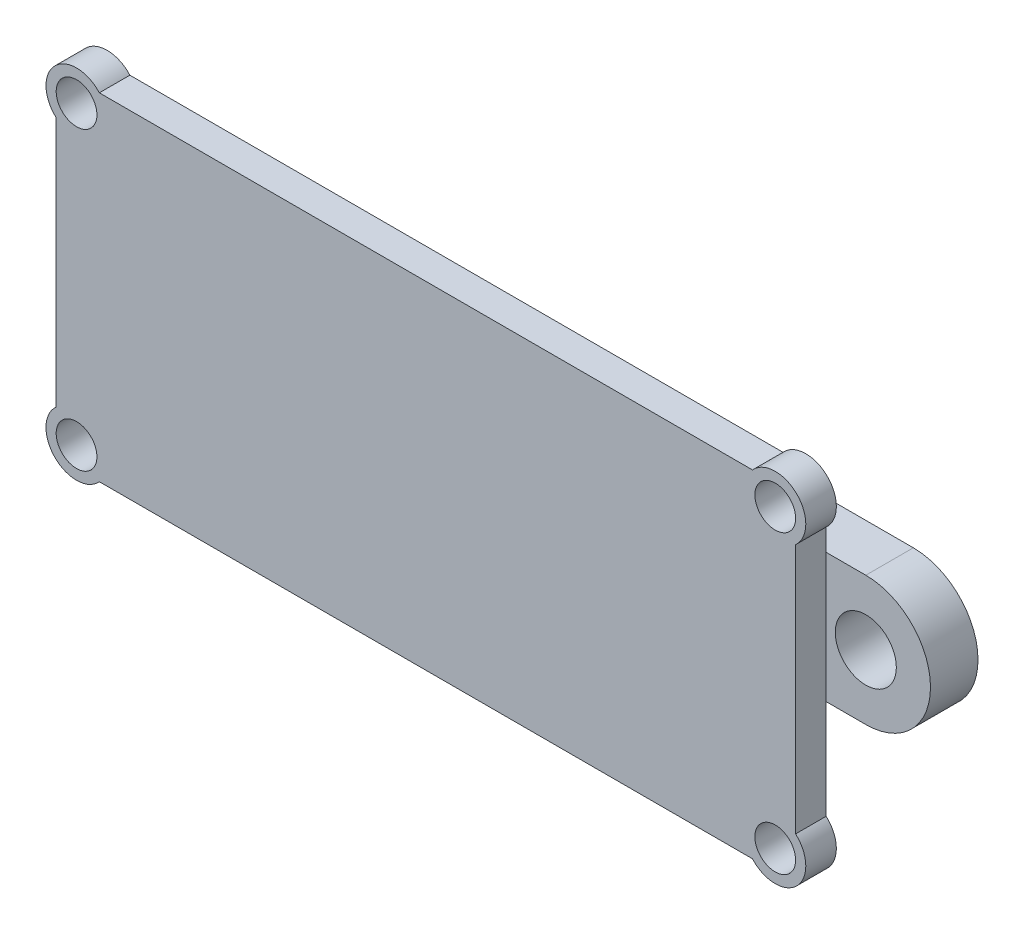
ISO-10303-21;
HEADER;
FILE_DESCRIPTION(('STEP AP214'),'2;1');
FILE_NAME('part.step','',(''),(''),'','','');
FILE_SCHEMA(('AUTOMOTIVE_DESIGN { 1 0 10303 214 1 1 1 1 }'));
ENDSEC;
DATA;
#1=APPLICATION_CONTEXT('core data for automotive mechanical design processes');
#2=APPLICATION_PROTOCOL_DEFINITION('international standard','automotive_design',2000,#1);
#3=PRODUCT_CONTEXT('',#1,'mechanical');
#4=PRODUCT('Part','Part','',(#3));
#5=PRODUCT_RELATED_PRODUCT_CATEGORY('part','',(#4));
#6=PRODUCT_DEFINITION_FORMATION('','',#4);
#7=PRODUCT_DEFINITION_CONTEXT('part definition',#1,'design');
#8=PRODUCT_DEFINITION('design','',#6,#7);
#9=PRODUCT_DEFINITION_SHAPE('','',#8);
#10=(LENGTH_UNIT() NAMED_UNIT(*) SI_UNIT(.MILLI.,.METRE.));
#11=(NAMED_UNIT(*) PLANE_ANGLE_UNIT() SI_UNIT($,.RADIAN.));
#12=(NAMED_UNIT(*) SI_UNIT($,.STERADIAN.) SOLID_ANGLE_UNIT());
#13=UNCERTAINTY_MEASURE_WITH_UNIT(LENGTH_MEASURE(1.E-05),#10,'distance_accuracy_value','');
#14=(GEOMETRIC_REPRESENTATION_CONTEXT(3) GLOBAL_UNCERTAINTY_ASSIGNED_CONTEXT((#13)) GLOBAL_UNIT_ASSIGNED_CONTEXT((#10,
#11,#12)) REPRESENTATION_CONTEXT('',''));
#15=CARTESIAN_POINT('',(0.,0.,0.));
#16=DIRECTION('',(0.,0.,1.));
#17=DIRECTION('',(1.,0.,0.));
#18=AXIS2_PLACEMENT_3D('',#15,#16,#17);
#19=CARTESIAN_POINT('',(0.,0.,3.5));
#20=DIRECTION('',(0.,0.,1.));
#21=DIRECTION('',(1.,0.,0.));
#22=AXIS2_PLACEMENT_3D('',#19,#20,#21);
#23=PLANE('',#22);
#24=CARTESIAN_POINT('',(0.,0.,3.5));
#25=DIRECTION('',(0.,0.,1.));
#26=DIRECTION('',(1.,0.,0.));
#27=AXIS2_PLACEMENT_3D('',#24,#25,#26);
#28=CIRCLE('',#27,2.24789999999995);
#29=CARTESIAN_POINT('',(2.24789999999995,0.,3.5));
#30=VERTEX_POINT('',#29);
#31=EDGE_CURVE('E292',#30,#30,#28,.T.);
#32=ORIENTED_EDGE('',*,*,#31,.F.);
#33=EDGE_LOOP('',(#32));
#34=FACE_BOUND('',#33,.T.);
#35=DIRECTION('',(-1.,0.,0.));
#36=VECTOR('',#35,1.);
#37=CARTESIAN_POINT('',(0.,4.7625,3.5));
#38=LINE('',#37,#36);
#39=CARTESIAN_POINT('',(0.,4.76249999999996,3.5));
#40=VERTEX_POINT('',#39);
#41=CARTESIAN_POINT('',(-14.3999999999999,4.7625,3.5));
#42=VERTEX_POINT('',#41);
#43=EDGE_CURVE('E279',#40,#42,#38,.T.);
#44=ORIENTED_EDGE('',*,*,#43,.T.);
#45=DIRECTION('',(0.,-1.,0.));
#46=VECTOR('',#45,1.);
#47=CARTESIAN_POINT('',(-14.3999999999999,0.,3.5));
#48=LINE('',#47,#46);
#49=CARTESIAN_POINT('',(-14.3999999999999,-4.7625,3.5));
#50=VERTEX_POINT('',#49);
#51=EDGE_CURVE('E264',#42,#50,#48,.T.);
#52=ORIENTED_EDGE('',*,*,#51,.T.);
#53=DIRECTION('',(-1.,0.,0.));
#54=VECTOR('',#53,1.);
#55=CARTESIAN_POINT('',(0.,-4.7625,3.5));
#56=LINE('',#55,#54);
#57=CARTESIAN_POINT('',(0.,-4.76249999999996,3.5));
#58=VERTEX_POINT('',#57);
#59=EDGE_CURVE('E286',#58,#50,#56,.T.);
#60=ORIENTED_EDGE('',*,*,#59,.F.);
#61=CARTESIAN_POINT('',(0.,0.,3.5));
#62=DIRECTION('',(0.,0.,1.));
#63=DIRECTION('',(1.,0.,0.));
#64=AXIS2_PLACEMENT_3D('',#61,#62,#63);
#65=CIRCLE('',#64,4.76249999999992);
#66=EDGE_CURVE('E288',#58,#40,#65,.T.);
#67=ORIENTED_EDGE('',*,*,#66,.T.);
#68=EDGE_LOOP('',(#44,#52,#60,#67));
#69=FACE_BOUND('',#68,.T.);
#70=ADVANCED_FACE('F41',(#34,#69),#23,.T.);
#71=CARTESIAN_POINT('',(0.,4.7625,3.5));
#72=DIRECTION('',(0.,-1.,0.));
#73=DIRECTION('',(1.,0.,0.));
#74=AXIS2_PLACEMENT_3D('',#71,#72,#73);
#75=PLANE('',#74);
#76=DIRECTION('',(0.,0.,-1.));
#77=VECTOR('',#76,1.);
#78=CARTESIAN_POINT('',(-36.3999999999999,4.7625,8.25));
#79=LINE('',#78,#77);
#80=CARTESIAN_POINT('',(-36.3999999999999,4.7625,4.25));
#81=VERTEX_POINT('',#80);
#82=CARTESIAN_POINT('',(-36.3999999999999,4.7625,3.5));
#83=VERTEX_POINT('',#82);
#84=EDGE_CURVE('E274',#81,#83,#79,.T.);
#85=ORIENTED_EDGE('',*,*,#84,.F.);
#86=DIRECTION('',(-1.,0.,0.));
#87=VECTOR('',#86,1.);
#88=CARTESIAN_POINT('',(-14.3999999999999,4.7625,4.25));
#89=LINE('',#88,#87);
#90=CARTESIAN_POINT('',(-14.3999999999999,4.7625,4.25));
#91=VERTEX_POINT('',#90);
#92=EDGE_CURVE('E324',#81,#91,#89,.F.);
#93=ORIENTED_EDGE('',*,*,#92,.T.);
#94=DIRECTION('',(0.,0.,-1.));
#95=VECTOR('',#94,1.);
#96=CARTESIAN_POINT('',(-14.3999999999999,4.7625,8.25));
#97=LINE('',#96,#95);
#98=EDGE_CURVE('E262',#91,#42,#97,.T.);
#99=ORIENTED_EDGE('',*,*,#98,.T.);
#100=ORIENTED_EDGE('',*,*,#43,.F.);
#101=DIRECTION('',(0.,0.,-1.));
#102=VECTOR('',#101,1.);
#103=CARTESIAN_POINT('',(0.,4.76249999999996,3.5));
#104=LINE('',#103,#102);
#105=CARTESIAN_POINT('',(0.,4.76249999999996,0.));
#106=VERTEX_POINT('',#105);
#107=EDGE_CURVE('E300',#40,#106,#104,.T.);
#108=ORIENTED_EDGE('',*,*,#107,.T.);
#109=DIRECTION('',(-1.,0.,0.));
#110=VECTOR('',#109,1.);
#111=CARTESIAN_POINT('',(0.,4.7625,0.));
#112=LINE('',#111,#110);
#113=CARTESIAN_POINT('',(-50.7999999999998,4.76250222053851,0.));
#114=VERTEX_POINT('',#113);
#115=EDGE_CURVE('E280',#106,#114,#112,.T.);
#116=ORIENTED_EDGE('',*,*,#115,.T.);
#117=DIRECTION('',(0.,0.,-1.));
#118=VECTOR('',#117,1.);
#119=CARTESIAN_POINT('',(-50.7999999999998,4.76250222053851,3.5));
#120=LINE('',#119,#118);
#121=CARTESIAN_POINT('',(-50.7999999999998,4.76250222053851,3.5));
#122=VERTEX_POINT('',#121);
#123=EDGE_CURVE('E319',#122,#114,#120,.T.);
#124=ORIENTED_EDGE('',*,*,#123,.F.);
#125=EDGE_CURVE('E285',#83,#122,#38,.T.);
#126=ORIENTED_EDGE('',*,*,#125,.F.);
#127=EDGE_LOOP('',(#85,#93,#99,#100,#108,#116,#124,#126));
#128=FACE_BOUND('',#127,.T.);
#129=ADVANCED_FACE('F358',(#128),#75,.F.);
#130=CARTESIAN_POINT('',(-50.7999999999998,4.44107708420793E-06,3.5));
#131=DIRECTION('',(0.,0.,-1.));
#132=DIRECTION('',(-1.,0.,0.));
#133=AXIS2_PLACEMENT_3D('',#130,#131,#132);
#134=CYLINDRICAL_SURFACE('',#133,4.76249999999994);
#135=CARTESIAN_POINT('',(-50.7999999999998,4.44107708420793E-06,0.));
#136=DIRECTION('',(0.,0.,1.));
#137=DIRECTION('',(1.,0.,0.));
#138=AXIS2_PLACEMENT_3D('',#135,#136,#137);
#139=CIRCLE('',#138,4.76249999999994);
#140=CARTESIAN_POINT('',(-50.7999999999998,-4.76249777946143,0.));
#141=VERTEX_POINT('',#140);
#142=EDGE_CURVE('E299',#114,#141,#139,.T.);
#143=ORIENTED_EDGE('',*,*,#142,.T.);
#144=DIRECTION('',(0.,0.,-1.));
#145=VECTOR('',#144,1.);
#146=CARTESIAN_POINT('',(-50.7999999999998,-4.76249777946143,3.5));
#147=LINE('',#146,#145);
#148=CARTESIAN_POINT('',(-50.7999999999998,-4.76249777946143,3.5));
#149=VERTEX_POINT('',#148);
#150=EDGE_CURVE('E318',#149,#141,#147,.T.);
#151=ORIENTED_EDGE('',*,*,#150,.F.);
#152=CARTESIAN_POINT('',(-50.7999999999998,4.44107708420793E-06,3.5));
#153=DIRECTION('',(0.,0.,1.));
#154=DIRECTION('',(1.,0.,0.));
#155=AXIS2_PLACEMENT_3D('',#152,#153,#154);
#156=CIRCLE('',#155,4.76249999999994);
#157=EDGE_CURVE('E281',#122,#149,#156,.T.);
#158=ORIENTED_EDGE('',*,*,#157,.F.);
#159=ORIENTED_EDGE('',*,*,#123,.T.);
#160=EDGE_LOOP('',(#143,#151,#158,#159));
#161=FACE_BOUND('',#160,.T.);
#162=ADVANCED_FACE('F383',(#161),#134,.T.);
#163=CARTESIAN_POINT('',(0.,-4.7625,3.5));
#164=DIRECTION('',(0.,-1.,0.));
#165=DIRECTION('',(1.,0.,0.));
#166=AXIS2_PLACEMENT_3D('',#163,#164,#165);
#167=PLANE('',#166);
#168=DIRECTION('',(-1.,0.,0.));
#169=VECTOR('',#168,1.);
#170=CARTESIAN_POINT('',(0.,-4.7625,0.));
#171=LINE('',#170,#169);
#172=CARTESIAN_POINT('',(0.,-4.76249999999996,0.));
#173=VERTEX_POINT('',#172);
#174=EDGE_CURVE('E302',#173,#141,#171,.T.);
#175=ORIENTED_EDGE('',*,*,#174,.F.);
#176=DIRECTION('',(0.,0.,-1.));
#177=VECTOR('',#176,1.);
#178=CARTESIAN_POINT('',(0.,-4.76249999999996,3.5));
#179=LINE('',#178,#177);
#180=EDGE_CURVE('E316',#58,#173,#179,.T.);
#181=ORIENTED_EDGE('',*,*,#180,.F.);
#182=ORIENTED_EDGE('',*,*,#59,.T.);
#183=DIRECTION('',(0.,0.,-1.));
#184=VECTOR('',#183,1.);
#185=CARTESIAN_POINT('',(-14.3999999999999,-4.7625,8.25));
#186=LINE('',#185,#184);
#187=CARTESIAN_POINT('',(-14.3999999999999,-4.7625,4.25));
#188=VERTEX_POINT('',#187);
#189=EDGE_CURVE('E271',#188,#50,#186,.T.);
#190=ORIENTED_EDGE('',*,*,#189,.F.);
#191=CARTESIAN_POINT('',(-10.3999999999999,-4.7625,4.25));
#192=DIRECTION('',(0.,-1.,0.));
#193=DIRECTION('',(1.,0.,0.));
#194=AXIS2_PLACEMENT_3D('',#191,#192,#193);
#195=CIRCLE('',#194,4.);
#196=CARTESIAN_POINT('',(-10.3999999999999,-4.7625,8.25));
#197=VERTEX_POINT('',#196);
#198=EDGE_CURVE('E47',#188,#197,#195,.F.);
#199=ORIENTED_EDGE('',*,*,#198,.T.);
#200=DIRECTION('',(1.,0.,0.));
#201=VECTOR('',#200,1.);
#202=CARTESIAN_POINT('',(0.,-4.7625,8.25));
#203=LINE('',#202,#201);
#204=CARTESIAN_POINT('',(-40.3999999999999,-4.76250000000001,8.25));
#205=VERTEX_POINT('',#204);
#206=EDGE_CURVE('E265',#205,#197,#203,.T.);
#207=ORIENTED_EDGE('',*,*,#206,.F.);
#208=CARTESIAN_POINT('',(-40.3999999999999,-4.76250000000001,4.25));
#209=DIRECTION('',(0.,-1.,0.));
#210=DIRECTION('',(1.,0.,0.));
#211=AXIS2_PLACEMENT_3D('',#208,#209,#210);
#212=CIRCLE('',#211,4.);
#213=CARTESIAN_POINT('',(-36.3999999999999,-4.7625,4.25));
#214=VERTEX_POINT('',#213);
#215=EDGE_CURVE('E62',#205,#214,#212,.F.);
#216=ORIENTED_EDGE('',*,*,#215,.T.);
#217=DIRECTION('',(0.,0.,-1.));
#218=VECTOR('',#217,1.);
#219=CARTESIAN_POINT('',(-36.3999999999999,-4.7625,8.25));
#220=LINE('',#219,#218);
#221=CARTESIAN_POINT('',(-36.3999999999999,-4.7625,3.5));
#222=VERTEX_POINT('',#221);
#223=EDGE_CURVE('E272',#214,#222,#220,.T.);
#224=ORIENTED_EDGE('',*,*,#223,.T.);
#225=EDGE_CURVE('E284',#222,#149,#56,.T.);
#226=ORIENTED_EDGE('',*,*,#225,.T.);
#227=ORIENTED_EDGE('',*,*,#150,.T.);
#228=EDGE_LOOP('',(#175,#181,#182,#190,#199,#207,#216,#224,#226,#227));
#229=FACE_BOUND('',#228,.T.);
#230=ADVANCED_FACE('F342',(#229),#167,.T.);
#231=CARTESIAN_POINT('',(0.,0.,3.5));
#232=DIRECTION('',(0.,0.,-1.));
#233=DIRECTION('',(-1.,0.,0.));
#234=AXIS2_PLACEMENT_3D('',#231,#232,#233);
#235=CYLINDRICAL_SURFACE('',#234,2.24789999999995);
#236=ORIENTED_EDGE('',*,*,#31,.T.);
#237=EDGE_LOOP('',(#236));
#238=FACE_BOUND('',#237,.T.);
#239=CARTESIAN_POINT('',(0.,0.,0.));
#240=DIRECTION('',(0.,0.,1.));
#241=DIRECTION('',(1.,0.,0.));
#242=AXIS2_PLACEMENT_3D('',#239,#240,#241);
#243=CIRCLE('',#242,2.24789999999995);
#244=CARTESIAN_POINT('',(2.24789999999995,0.,0.));
#245=VERTEX_POINT('',#244);
#246=EDGE_CURVE('E306',#245,#245,#243,.T.);
#247=ORIENTED_EDGE('',*,*,#246,.F.);
#248=EDGE_LOOP('',(#247));
#249=FACE_BOUND('',#248,.T.);
#250=ADVANCED_FACE('F494',(#238,#249),#235,.F.);
#251=CARTESIAN_POINT('',(0.,0.,3.5));
#252=DIRECTION('',(0.,0.,-1.));
#253=DIRECTION('',(-1.,0.,0.));
#254=AXIS2_PLACEMENT_3D('',#251,#252,#253);
#255=CYLINDRICAL_SURFACE('',#254,4.76249999999992);
#256=CARTESIAN_POINT('',(0.,0.,0.));
#257=DIRECTION('',(0.,0.,1.));
#258=DIRECTION('',(1.,0.,0.));
#259=AXIS2_PLACEMENT_3D('',#256,#257,#258);
#260=CIRCLE('',#259,4.76249999999992);
#261=EDGE_CURVE('E308',#173,#106,#260,.T.);
#262=ORIENTED_EDGE('',*,*,#261,.T.);
#263=ORIENTED_EDGE('',*,*,#107,.F.);
#264=ORIENTED_EDGE('',*,*,#66,.F.);
#265=ORIENTED_EDGE('',*,*,#180,.T.);
#266=EDGE_LOOP('',(#262,#263,#264,#265));
#267=FACE_BOUND('',#266,.T.);
#268=ADVANCED_FACE('F400',(#267),#255,.T.);
#269=CARTESIAN_POINT('',(-50.7999999999998,4.44107708420793E-06,3.5));
#270=DIRECTION('',(0.,0.,-1.));
#271=DIRECTION('',(-1.,0.,0.));
#272=AXIS2_PLACEMENT_3D('',#269,#270,#271);
#273=CYLINDRICAL_SURFACE('',#272,2.24789999999993);
#274=CARTESIAN_POINT('',(-50.7999999999998,4.44107708420793E-06,3.5));
#275=DIRECTION('',(0.,0.,1.));
#276=DIRECTION('',(1.,0.,0.));
#277=AXIS2_PLACEMENT_3D('',#274,#275,#276);
#278=CIRCLE('',#277,2.24789999999993);
#279=CARTESIAN_POINT('',(-48.5520999999999,4.44107708420793E-06,3.5));
#280=VERTEX_POINT('',#279);
#281=EDGE_CURVE('E294',#280,#280,#278,.T.);
#282=ORIENTED_EDGE('',*,*,#281,.T.);
#283=EDGE_LOOP('',(#282));
#284=FACE_BOUND('',#283,.T.);
#285=CARTESIAN_POINT('',(-50.7999999999998,4.44107708420793E-06,0.));
#286=DIRECTION('',(0.,0.,1.));
#287=DIRECTION('',(1.,0.,0.));
#288=AXIS2_PLACEMENT_3D('',#285,#286,#287);
#289=CIRCLE('',#288,2.24789999999993);
#290=CARTESIAN_POINT('',(-48.5520999999999,4.44107708420793E-06,0.));
#291=VERTEX_POINT('',#290);
#292=EDGE_CURVE('E313',#291,#291,#289,.T.);
#293=ORIENTED_EDGE('',*,*,#292,.F.);
#294=EDGE_LOOP('',(#293));
#295=FACE_BOUND('',#294,.T.);
#296=ADVANCED_FACE('F388',(#284,#295),#273,.F.);
#297=DIRECTION('',(0.,-1.,0.));
#298=VECTOR('',#297,1.);
#299=CARTESIAN_POINT('',(-36.3999999999999,0.,3.5));
#300=LINE('',#299,#298);
#301=EDGE_CURVE('E176',#83,#222,#300,.T.);
#302=ORIENTED_EDGE('',*,*,#301,.F.);
#303=ORIENTED_EDGE('',*,*,#125,.T.);
#304=ORIENTED_EDGE('',*,*,#157,.T.);
#305=ORIENTED_EDGE('',*,*,#225,.F.);
#306=EDGE_LOOP('',(#302,#303,#304,#305));
#307=FACE_BOUND('',#306,.T.);
#308=ORIENTED_EDGE('',*,*,#281,.F.);
#309=EDGE_LOOP('',(#308));
#310=FACE_BOUND('',#309,.T.);
#311=ADVANCED_FACE('F378',(#307,#310),#23,.T.);
#312=CARTESIAN_POINT('',(0.,0.,0.));
#313=DIRECTION('',(0.,0.,1.));
#314=DIRECTION('',(1.,0.,0.));
#315=AXIS2_PLACEMENT_3D('',#312,#313,#314);
#316=PLANE('',#315);
#317=ORIENTED_EDGE('',*,*,#115,.F.);
#318=ORIENTED_EDGE('',*,*,#261,.F.);
#319=ORIENTED_EDGE('',*,*,#174,.T.);
#320=ORIENTED_EDGE('',*,*,#142,.F.);
#321=EDGE_LOOP('',(#317,#318,#319,#320));
#322=FACE_BOUND('',#321,.T.);
#323=ORIENTED_EDGE('',*,*,#246,.T.);
#324=EDGE_LOOP('',(#323));
#325=FACE_BOUND('',#324,.T.);
#326=ORIENTED_EDGE('',*,*,#292,.T.);
#327=EDGE_LOOP('',(#326));
#328=FACE_BOUND('',#327,.T.);
#329=ADVANCED_FACE('F386',(#322,#325,#328),#316,.F.);
#330=CARTESIAN_POINT('',(-36.3999999999999,0.,8.25));
#331=DIRECTION('',(1.,0.,0.));
#332=DIRECTION('',(0.,0.,-1.));
#333=AXIS2_PLACEMENT_3D('',#330,#331,#332);
#334=PLANE('',#333);
#335=ORIENTED_EDGE('',*,*,#223,.F.);
#336=DIRECTION('',(0.,-1.,0.));
#337=VECTOR('',#336,1.);
#338=CARTESIAN_POINT('',(-36.3999999999999,8.76249999999999,4.25));
#339=LINE('',#338,#337);
#340=EDGE_CURVE('E331',#214,#81,#339,.F.);
#341=ORIENTED_EDGE('',*,*,#340,.T.);
#342=ORIENTED_EDGE('',*,*,#84,.T.);
#343=ORIENTED_EDGE('',*,*,#301,.T.);
#344=EDGE_LOOP('',(#335,#341,#342,#343));
#345=FACE_BOUND('',#344,.T.);
#346=ADVANCED_FACE('F353',(#345),#334,.F.);
#347=CARTESIAN_POINT('',(-14.3999999999999,0.,8.25));
#348=DIRECTION('',(1.,0.,0.));
#349=DIRECTION('',(0.,0.,-1.));
#350=AXIS2_PLACEMENT_3D('',#347,#348,#349);
#351=PLANE('',#350);
#352=ORIENTED_EDGE('',*,*,#98,.F.);
#353=DIRECTION('',(0.,-1.,0.));
#354=VECTOR('',#353,1.);
#355=CARTESIAN_POINT('',(-14.3999999999999,0.,4.25));
#356=LINE('',#355,#354);
#357=EDGE_CURVE('E336',#91,#188,#356,.T.);
#358=ORIENTED_EDGE('',*,*,#357,.T.);
#359=ORIENTED_EDGE('',*,*,#189,.T.);
#360=ORIENTED_EDGE('',*,*,#51,.F.);
#361=EDGE_LOOP('',(#352,#358,#359,#360));
#362=FACE_BOUND('',#361,.T.);
#363=ADVANCED_FACE('F420',(#362),#351,.T.);
#364=CARTESIAN_POINT('',(0.,0.,8.25));
#365=DIRECTION('',(0.,0.,1.));
#366=DIRECTION('',(1.,0.,0.));
#367=AXIS2_PLACEMENT_3D('',#364,#365,#366);
#368=PLANE('',#367);
#369=CARTESIAN_POINT('',(0.330000000000082,12.805,8.25));
#370=DIRECTION('',(0.,0.,1.));
#371=DIRECTION('',(1.,0.,0.));
#372=AXIS2_PLACEMENT_3D('',#369,#370,#371);
#373=CIRCLE('',#372,1.5);
#374=CARTESIAN_POINT('',(1.83000000000008,12.805,8.25));
#375=VERTEX_POINT('',#374);
#376=EDGE_CURVE('E216',#375,#375,#373,.T.);
#377=ORIENTED_EDGE('',*,*,#376,.T.);
#378=EDGE_LOOP('',(#377));
#379=FACE_BOUND('',#378,.T.);
#380=CARTESIAN_POINT('',(-51.1299999999999,12.805,8.25));
#381=DIRECTION('',(0.,0.,1.));
#382=DIRECTION('',(1.,0.,0.));
#383=AXIS2_PLACEMENT_3D('',#380,#381,#382);
#384=CIRCLE('',#383,1.5);
#385=CARTESIAN_POINT('',(-49.6299999999999,12.805,8.25));
#386=VERTEX_POINT('',#385);
#387=EDGE_CURVE('E218',#386,#386,#384,.T.);
#388=ORIENTED_EDGE('',*,*,#387,.T.);
#389=EDGE_LOOP('',(#388));
#390=FACE_BOUND('',#389,.T.);
#391=CARTESIAN_POINT('',(0.330000000000082,-9.,8.25));
#392=DIRECTION('',(0.,0.,1.));
#393=DIRECTION('',(1.,0.,0.));
#394=AXIS2_PLACEMENT_3D('',#391,#392,#393);
#395=CIRCLE('',#394,1.5);
#396=CARTESIAN_POINT('',(1.83000000000008,-9.,8.25));
#397=VERTEX_POINT('',#396);
#398=EDGE_CURVE('E225',#397,#397,#395,.T.);
#399=ORIENTED_EDGE('',*,*,#398,.T.);
#400=EDGE_LOOP('',(#399));
#401=FACE_BOUND('',#400,.T.);
#402=DIRECTION('',(0.,-1.,0.));
#403=VECTOR('',#402,1.);
#404=CARTESIAN_POINT('',(1.83000000000008,0.,8.25));
#405=LINE('',#404,#403);
#406=CARTESIAN_POINT('',(1.83000000000008,11.1279490168752,8.25));
#407=VERTEX_POINT('',#406);
#408=CARTESIAN_POINT('',(1.83000000000008,-7.32294901687516,8.25));
#409=VERTEX_POINT('',#408);
#410=EDGE_CURVE('E175',#407,#409,#405,.T.);
#411=ORIENTED_EDGE('',*,*,#410,.T.);
#412=CARTESIAN_POINT('',(0.330000000000082,-9.,8.25));
#413=DIRECTION('',(0.,0.,1.));
#414=DIRECTION('',(1.,0.,0.));
#415=AXIS2_PLACEMENT_3D('',#412,#413,#414);
#416=CIRCLE('',#415,2.25);
#417=CARTESIAN_POINT('',(-1.34705098312476,-10.5,8.25));
#418=VERTEX_POINT('',#417);
#419=EDGE_CURVE('E242',#418,#409,#416,.T.);
#420=ORIENTED_EDGE('',*,*,#419,.F.);
#421=DIRECTION('',(-1.,0.,0.));
#422=VECTOR('',#421,1.);
#423=CARTESIAN_POINT('',(0.,-10.5,8.25));
#424=LINE('',#423,#422);
#425=CARTESIAN_POINT('',(-49.4529490168751,-10.5,8.25));
#426=VERTEX_POINT('',#425);
#427=EDGE_CURVE('E238',#418,#426,#424,.T.);
#428=ORIENTED_EDGE('',*,*,#427,.T.);
#429=CARTESIAN_POINT('',(-51.1299999999999,-9.,8.25));
#430=DIRECTION('',(0.,0.,1.));
#431=DIRECTION('',(1.,0.,0.));
#432=AXIS2_PLACEMENT_3D('',#429,#430,#431);
#433=CIRCLE('',#432,2.25);
#434=CARTESIAN_POINT('',(-52.6299999999999,-7.32294901687516,8.25));
#435=VERTEX_POINT('',#434);
#436=EDGE_CURVE('E240',#435,#426,#433,.T.);
#437=ORIENTED_EDGE('',*,*,#436,.F.);
#438=DIRECTION('',(0.,1.,0.));
#439=VECTOR('',#438,1.);
#440=CARTESIAN_POINT('',(-52.6299999999999,0.,8.25));
#441=LINE('',#440,#439);
#442=CARTESIAN_POINT('',(-52.6299999999999,11.1279490168751,8.25));
#443=VERTEX_POINT('',#442);
#444=EDGE_CURVE('E233',#435,#443,#441,.T.);
#445=ORIENTED_EDGE('',*,*,#444,.T.);
#446=CARTESIAN_POINT('',(-51.1299999999999,12.805,8.25));
#447=DIRECTION('',(0.,0.,1.));
#448=DIRECTION('',(1.,0.,0.));
#449=AXIS2_PLACEMENT_3D('',#446,#447,#448);
#450=CIRCLE('',#449,2.25);
#451=CARTESIAN_POINT('',(-49.4529490168751,14.305,8.25));
#452=VERTEX_POINT('',#451);
#453=EDGE_CURVE('E231',#452,#443,#450,.T.);
#454=ORIENTED_EDGE('',*,*,#453,.F.);
#455=DIRECTION('',(1.,0.,0.));
#456=VECTOR('',#455,1.);
#457=CARTESIAN_POINT('',(0.,14.305,8.25));
#458=LINE('',#457,#456);
#459=CARTESIAN_POINT('',(-1.34705098312476,14.305,8.25));
#460=VERTEX_POINT('',#459);
#461=EDGE_CURVE('E227',#452,#460,#458,.T.);
#462=ORIENTED_EDGE('',*,*,#461,.T.);
#463=CARTESIAN_POINT('',(0.330000000000082,12.805,8.25));
#464=DIRECTION('',(0.,0.,1.));
#465=DIRECTION('',(1.,0.,0.));
#466=AXIS2_PLACEMENT_3D('',#463,#464,#465);
#467=CIRCLE('',#466,2.25);
#468=EDGE_CURVE('E226',#407,#460,#467,.T.);
#469=ORIENTED_EDGE('',*,*,#468,.F.);
#470=EDGE_LOOP('',(#411,#420,#428,#437,#445,#454,#462,#469));
#471=FACE_BOUND('',#470,.T.);
#472=CARTESIAN_POINT('',(-51.1299999999999,-9.,8.25));
#473=DIRECTION('',(0.,0.,1.));
#474=DIRECTION('',(1.,0.,0.));
#475=AXIS2_PLACEMENT_3D('',#472,#473,#474);
#476=CIRCLE('',#475,1.5);
#477=CARTESIAN_POINT('',(-49.6299999999999,-9.,8.25));
#478=VERTEX_POINT('',#477);
#479=EDGE_CURVE('E246',#478,#478,#476,.T.);
#480=ORIENTED_EDGE('',*,*,#479,.T.);
#481=EDGE_LOOP('',(#480));
#482=FACE_BOUND('',#481,.T.);
#483=DIRECTION('',(0.,-1.,0.));
#484=VECTOR('',#483,1.);
#485=CARTESIAN_POINT('',(-40.3999999999999,-4.7625,8.25));
#486=LINE('',#485,#484);
#487=CARTESIAN_POINT('',(-40.3999999999999,8.76249999999999,8.25));
#488=VERTEX_POINT('',#487);
#489=EDGE_CURVE('E332',#488,#205,#486,.T.);
#490=ORIENTED_EDGE('',*,*,#489,.T.);
#491=ORIENTED_EDGE('',*,*,#206,.T.);
#492=DIRECTION('',(0.,-1.,0.));
#493=VECTOR('',#492,1.);
#494=CARTESIAN_POINT('',(-10.3999999999999,0.,8.25));
#495=LINE('',#494,#493);
#496=CARTESIAN_POINT('',(-10.3999999999999,8.7625,8.25));
#497=VERTEX_POINT('',#496);
#498=EDGE_CURVE('E327',#197,#497,#495,.F.);
#499=ORIENTED_EDGE('',*,*,#498,.T.);
#500=DIRECTION('',(-1.,0.,0.));
#501=VECTOR('',#500,1.);
#502=CARTESIAN_POINT('',(-36.3999999999999,8.76249999999999,8.25));
#503=LINE('',#502,#501);
#504=EDGE_CURVE('E323',#497,#488,#503,.T.);
#505=ORIENTED_EDGE('',*,*,#504,.T.);
#506=EDGE_LOOP('',(#490,#491,#499,#505));
#507=FACE_BOUND('',#506,.T.);
#508=ADVANCED_FACE('F347',(#379,#390,#401,#471,#482,#507),#368,.F.);
#509=CARTESIAN_POINT('',(1.83000000000008,0.,10.5));
#510=DIRECTION('',(1.,0.,0.));
#511=DIRECTION('',(0.,1.,0.));
#512=AXIS2_PLACEMENT_3D('',#509,#510,#511);
#513=PLANE('',#512);
#514=ORIENTED_EDGE('',*,*,#410,.F.);
#515=DIRECTION('',(0.,0.,-1.));
#516=VECTOR('',#515,1.);
#517=CARTESIAN_POINT('',(1.83000000000008,11.1279490168752,10.5));
#518=LINE('',#517,#516);
#519=CARTESIAN_POINT('',(1.83000000000008,11.1279490168752,10.5));
#520=VERTEX_POINT('',#519);
#521=EDGE_CURVE('E167',#520,#407,#518,.T.);
#522=ORIENTED_EDGE('',*,*,#521,.F.);
#523=DIRECTION('',(0.,-1.,0.));
#524=VECTOR('',#523,1.);
#525=CARTESIAN_POINT('',(1.83000000000008,0.,10.5));
#526=LINE('',#525,#524);
#527=CARTESIAN_POINT('',(1.83000000000008,-7.32294901687516,10.5));
#528=VERTEX_POINT('',#527);
#529=EDGE_CURVE('E168',#520,#528,#526,.T.);
#530=ORIENTED_EDGE('',*,*,#529,.T.);
#531=DIRECTION('',(0.,0.,-1.));
#532=VECTOR('',#531,1.);
#533=CARTESIAN_POINT('',(1.83000000000008,-7.32294901687516,10.5));
#534=LINE('',#533,#532);
#535=EDGE_CURVE('E214',#528,#409,#534,.T.);
#536=ORIENTED_EDGE('',*,*,#535,.T.);
#537=EDGE_LOOP('',(#514,#522,#530,#536));
#538=FACE_BOUND('',#537,.T.);
#539=ADVANCED_FACE('F169',(#538),#513,.T.);
#540=CARTESIAN_POINT('',(0.330000000000082,12.805,10.5));
#541=DIRECTION('',(0.,0.,-1.));
#542=DIRECTION('',(-1.,0.,0.));
#543=AXIS2_PLACEMENT_3D('',#540,#541,#542);
#544=CYLINDRICAL_SURFACE('',#543,2.25);
#545=ORIENTED_EDGE('',*,*,#468,.T.);
#546=DIRECTION('',(0.,0.,-1.));
#547=VECTOR('',#546,1.);
#548=CARTESIAN_POINT('',(-1.34705098312476,14.305,10.5));
#549=LINE('',#548,#547);
#550=CARTESIAN_POINT('',(-1.34705098312476,14.305,10.5));
#551=VERTEX_POINT('',#550);
#552=EDGE_CURVE('E180',#551,#460,#549,.T.);
#553=ORIENTED_EDGE('',*,*,#552,.F.);
#554=CARTESIAN_POINT('',(0.330000000000082,12.805,10.5));
#555=DIRECTION('',(0.,0.,1.));
#556=DIRECTION('',(1.,0.,0.));
#557=AXIS2_PLACEMENT_3D('',#554,#555,#556);
#558=CIRCLE('',#557,2.25);
#559=EDGE_CURVE('E179',#520,#551,#558,.T.);
#560=ORIENTED_EDGE('',*,*,#559,.F.);
#561=ORIENTED_EDGE('',*,*,#521,.T.);
#562=EDGE_LOOP('',(#545,#553,#560,#561));
#563=FACE_BOUND('',#562,.T.);
#564=ADVANCED_FACE('F182',(#563),#544,.T.);
#565=CARTESIAN_POINT('',(0.,14.305,10.5));
#566=DIRECTION('',(0.,1.,0.));
#567=DIRECTION('',(-1.,0.,0.));
#568=AXIS2_PLACEMENT_3D('',#565,#566,#567);
#569=PLANE('',#568);
#570=ORIENTED_EDGE('',*,*,#461,.F.);
#571=DIRECTION('',(0.,0.,-1.));
#572=VECTOR('',#571,1.);
#573=CARTESIAN_POINT('',(-49.4529490168751,14.305,10.5));
#574=LINE('',#573,#572);
#575=CARTESIAN_POINT('',(-49.4529490168751,14.305,10.5));
#576=VERTEX_POINT('',#575);
#577=EDGE_CURVE('E259',#576,#452,#574,.T.);
#578=ORIENTED_EDGE('',*,*,#577,.F.);
#579=DIRECTION('',(1.,0.,0.));
#580=VECTOR('',#579,1.);
#581=CARTESIAN_POINT('',(0.,14.305,10.5));
#582=LINE('',#581,#580);
#583=EDGE_CURVE('E183',#576,#551,#582,.T.);
#584=ORIENTED_EDGE('',*,*,#583,.T.);
#585=ORIENTED_EDGE('',*,*,#552,.T.);
#586=EDGE_LOOP('',(#570,#578,#584,#585));
#587=FACE_BOUND('',#586,.T.);
#588=ADVANCED_FACE('F441',(#587),#569,.T.);
#589=CARTESIAN_POINT('',(-51.1299999999999,12.805,10.5));
#590=DIRECTION('',(0.,0.,-1.));
#591=DIRECTION('',(-1.,0.,0.));
#592=AXIS2_PLACEMENT_3D('',#589,#590,#591);
#593=CYLINDRICAL_SURFACE('',#592,2.25);
#594=ORIENTED_EDGE('',*,*,#453,.T.);
#595=DIRECTION('',(0.,0.,-1.));
#596=VECTOR('',#595,1.);
#597=CARTESIAN_POINT('',(-52.6299999999999,11.1279490168751,10.5));
#598=LINE('',#597,#596);
#599=CARTESIAN_POINT('',(-52.6299999999999,11.1279490168751,10.5));
#600=VERTEX_POINT('',#599);
#601=EDGE_CURVE('E260',#600,#443,#598,.T.);
#602=ORIENTED_EDGE('',*,*,#601,.F.);
#603=CARTESIAN_POINT('',(-51.1299999999999,12.805,10.5));
#604=DIRECTION('',(0.,0.,1.));
#605=DIRECTION('',(1.,0.,0.));
#606=AXIS2_PLACEMENT_3D('',#603,#604,#605);
#607=CIRCLE('',#606,2.25);
#608=EDGE_CURVE('E203',#576,#600,#607,.T.);
#609=ORIENTED_EDGE('',*,*,#608,.F.);
#610=ORIENTED_EDGE('',*,*,#577,.T.);
#611=EDGE_LOOP('',(#594,#602,#609,#610));
#612=FACE_BOUND('',#611,.T.);
#613=ADVANCED_FACE('F450',(#612),#593,.T.);
#614=CARTESIAN_POINT('',(-52.6299999999999,0.,10.5));
#615=DIRECTION('',(-1.,0.,0.));
#616=DIRECTION('',(0.,0.,1.));
#617=AXIS2_PLACEMENT_3D('',#614,#615,#616);
#618=PLANE('',#617);
#619=ORIENTED_EDGE('',*,*,#444,.F.);
#620=DIRECTION('',(0.,0.,-1.));
#621=VECTOR('',#620,1.);
#622=CARTESIAN_POINT('',(-52.6299999999999,-7.32294901687516,10.5));
#623=LINE('',#622,#621);
#624=CARTESIAN_POINT('',(-52.6299999999999,-7.32294901687516,10.5));
#625=VERTEX_POINT('',#624);
#626=EDGE_CURVE('E254',#625,#435,#623,.T.);
#627=ORIENTED_EDGE('',*,*,#626,.F.);
#628=DIRECTION('',(0.,1.,0.));
#629=VECTOR('',#628,1.);
#630=CARTESIAN_POINT('',(-52.6299999999999,0.,10.5));
#631=LINE('',#630,#629);
#632=EDGE_CURVE('E201',#625,#600,#631,.T.);
#633=ORIENTED_EDGE('',*,*,#632,.T.);
#634=ORIENTED_EDGE('',*,*,#601,.T.);
#635=EDGE_LOOP('',(#619,#627,#633,#634));
#636=FACE_BOUND('',#635,.T.);
#637=ADVANCED_FACE('F451',(#636),#618,.T.);
#638=CARTESIAN_POINT('',(-51.1299999999999,-9.,10.5));
#639=DIRECTION('',(0.,0.,-1.));
#640=DIRECTION('',(-1.,0.,0.));
#641=AXIS2_PLACEMENT_3D('',#638,#639,#640);
#642=CYLINDRICAL_SURFACE('',#641,2.25);
#643=ORIENTED_EDGE('',*,*,#436,.T.);
#644=DIRECTION('',(0.,0.,-1.));
#645=VECTOR('',#644,1.);
#646=CARTESIAN_POINT('',(-49.4529490168751,-10.5,10.5));
#647=LINE('',#646,#645);
#648=CARTESIAN_POINT('',(-49.4529490168751,-10.5,10.5));
#649=VERTEX_POINT('',#648);
#650=EDGE_CURVE('E251',#649,#426,#647,.T.);
#651=ORIENTED_EDGE('',*,*,#650,.F.);
#652=CARTESIAN_POINT('',(-51.1299999999999,-9.,10.5));
#653=DIRECTION('',(0.,0.,1.));
#654=DIRECTION('',(1.,0.,0.));
#655=AXIS2_PLACEMENT_3D('',#652,#653,#654);
#656=CIRCLE('',#655,2.25);
#657=EDGE_CURVE('E206',#625,#649,#656,.T.);
#658=ORIENTED_EDGE('',*,*,#657,.F.);
#659=ORIENTED_EDGE('',*,*,#626,.T.);
#660=EDGE_LOOP('',(#643,#651,#658,#659));
#661=FACE_BOUND('',#660,.T.);
#662=ADVANCED_FACE('F454',(#661),#642,.T.);
#663=CARTESIAN_POINT('',(0.,-10.5,10.5));
#664=DIRECTION('',(0.,-1.,0.));
#665=DIRECTION('',(0.,0.,-1.));
#666=AXIS2_PLACEMENT_3D('',#663,#664,#665);
#667=PLANE('',#666);
#668=ORIENTED_EDGE('',*,*,#427,.F.);
#669=DIRECTION('',(0.,0.,-1.));
#670=VECTOR('',#669,1.);
#671=CARTESIAN_POINT('',(-1.34705098312476,-10.5,10.5));
#672=LINE('',#671,#670);
#673=CARTESIAN_POINT('',(-1.34705098312476,-10.5,10.5));
#674=VERTEX_POINT('',#673);
#675=EDGE_CURVE('E253',#674,#418,#672,.T.);
#676=ORIENTED_EDGE('',*,*,#675,.F.);
#677=DIRECTION('',(-1.,0.,0.));
#678=VECTOR('',#677,1.);
#679=CARTESIAN_POINT('',(0.,-10.5,10.5));
#680=LINE('',#679,#678);
#681=EDGE_CURVE('E208',#674,#649,#680,.T.);
#682=ORIENTED_EDGE('',*,*,#681,.T.);
#683=ORIENTED_EDGE('',*,*,#650,.T.);
#684=EDGE_LOOP('',(#668,#676,#682,#683));
#685=FACE_BOUND('',#684,.T.);
#686=ADVANCED_FACE('F459',(#685),#667,.T.);
#687=CARTESIAN_POINT('',(0.330000000000082,-9.,10.5));
#688=DIRECTION('',(0.,0.,-1.));
#689=DIRECTION('',(-1.,0.,0.));
#690=AXIS2_PLACEMENT_3D('',#687,#688,#689);
#691=CYLINDRICAL_SURFACE('',#690,2.25);
#692=ORIENTED_EDGE('',*,*,#419,.T.);
#693=ORIENTED_EDGE('',*,*,#535,.F.);
#694=CARTESIAN_POINT('',(0.330000000000082,-9.,10.5));
#695=DIRECTION('',(0.,0.,1.));
#696=DIRECTION('',(1.,0.,0.));
#697=AXIS2_PLACEMENT_3D('',#694,#695,#696);
#698=CIRCLE('',#697,2.25);
#699=EDGE_CURVE('E191',#674,#528,#698,.T.);
#700=ORIENTED_EDGE('',*,*,#699,.F.);
#701=ORIENTED_EDGE('',*,*,#675,.T.);
#702=EDGE_LOOP('',(#692,#693,#700,#701));
#703=FACE_BOUND('',#702,.T.);
#704=ADVANCED_FACE('F438',(#703),#691,.T.);
#705=CARTESIAN_POINT('',(0.330000000000082,-9.,10.5));
#706=DIRECTION('',(0.,0.,-1.));
#707=DIRECTION('',(-1.,0.,0.));
#708=AXIS2_PLACEMENT_3D('',#705,#706,#707);
#709=CYLINDRICAL_SURFACE('',#708,1.5);
#710=CARTESIAN_POINT('',(0.330000000000082,-9.,10.5));
#711=DIRECTION('',(0.,0.,1.));
#712=DIRECTION('',(1.,0.,0.));
#713=AXIS2_PLACEMENT_3D('',#710,#711,#712);
#714=CIRCLE('',#713,1.5);
#715=CARTESIAN_POINT('',(1.83000000000008,-9.,10.5));
#716=VERTEX_POINT('',#715);
#717=EDGE_CURVE('E192',#716,#716,#714,.T.);
#718=ORIENTED_EDGE('',*,*,#717,.T.);
#719=EDGE_LOOP('',(#718));
#720=FACE_BOUND('',#719,.T.);
#721=ORIENTED_EDGE('',*,*,#398,.F.);
#722=EDGE_LOOP('',(#721));
#723=FACE_BOUND('',#722,.T.);
#724=ADVANCED_FACE('F434',(#720,#723),#709,.F.);
#725=CARTESIAN_POINT('',(-51.1299999999999,12.805,10.5));
#726=DIRECTION('',(0.,0.,-1.));
#727=DIRECTION('',(-1.,0.,0.));
#728=AXIS2_PLACEMENT_3D('',#725,#726,#727);
#729=CYLINDRICAL_SURFACE('',#728,1.5);
#730=CARTESIAN_POINT('',(-51.1299999999999,12.805,10.5));
#731=DIRECTION('',(0.,0.,1.));
#732=DIRECTION('',(1.,0.,0.));
#733=AXIS2_PLACEMENT_3D('',#730,#731,#732);
#734=CIRCLE('',#733,1.5);
#735=CARTESIAN_POINT('',(-49.6299999999999,12.805,10.5));
#736=VERTEX_POINT('',#735);
#737=EDGE_CURVE('E198',#736,#736,#734,.T.);
#738=ORIENTED_EDGE('',*,*,#737,.T.);
#739=EDGE_LOOP('',(#738));
#740=FACE_BOUND('',#739,.T.);
#741=ORIENTED_EDGE('',*,*,#387,.F.);
#742=EDGE_LOOP('',(#741));
#743=FACE_BOUND('',#742,.T.);
#744=ADVANCED_FACE('F431',(#740,#743),#729,.F.);
#745=CARTESIAN_POINT('',(0.330000000000082,12.805,10.5));
#746=DIRECTION('',(0.,0.,-1.));
#747=DIRECTION('',(-1.,0.,0.));
#748=AXIS2_PLACEMENT_3D('',#745,#746,#747);
#749=CYLINDRICAL_SURFACE('',#748,1.5);
#750=CARTESIAN_POINT('',(0.330000000000082,12.805,10.5));
#751=DIRECTION('',(0.,0.,1.));
#752=DIRECTION('',(1.,0.,0.));
#753=AXIS2_PLACEMENT_3D('',#750,#751,#752);
#754=CIRCLE('',#753,1.5);
#755=CARTESIAN_POINT('',(1.83000000000008,12.805,10.5));
#756=VERTEX_POINT('',#755);
#757=EDGE_CURVE('E248',#756,#756,#754,.T.);
#758=ORIENTED_EDGE('',*,*,#757,.T.);
#759=EDGE_LOOP('',(#758));
#760=FACE_BOUND('',#759,.T.);
#761=ORIENTED_EDGE('',*,*,#376,.F.);
#762=EDGE_LOOP('',(#761));
#763=FACE_BOUND('',#762,.T.);
#764=ADVANCED_FACE('F428',(#760,#763),#749,.F.);
#765=CARTESIAN_POINT('',(-51.1299999999999,-9.,10.5));
#766=DIRECTION('',(0.,0.,-1.));
#767=DIRECTION('',(-1.,0.,0.));
#768=AXIS2_PLACEMENT_3D('',#765,#766,#767);
#769=CYLINDRICAL_SURFACE('',#768,1.5);
#770=CARTESIAN_POINT('',(-51.1299999999999,-9.,10.5));
#771=DIRECTION('',(0.,0.,1.));
#772=DIRECTION('',(1.,0.,0.));
#773=AXIS2_PLACEMENT_3D('',#770,#771,#772);
#774=CIRCLE('',#773,1.5);
#775=CARTESIAN_POINT('',(-49.6299999999999,-9.,10.5));
#776=VERTEX_POINT('',#775);
#777=EDGE_CURVE('E215',#776,#776,#774,.T.);
#778=ORIENTED_EDGE('',*,*,#777,.T.);
#779=EDGE_LOOP('',(#778));
#780=FACE_BOUND('',#779,.T.);
#781=ORIENTED_EDGE('',*,*,#479,.F.);
#782=EDGE_LOOP('',(#781));
#783=FACE_BOUND('',#782,.T.);
#784=ADVANCED_FACE('F371',(#780,#783),#769,.F.);
#785=CARTESIAN_POINT('',(0.,0.,10.5));
#786=DIRECTION('',(0.,0.,1.));
#787=DIRECTION('',(1.,0.,0.));
#788=AXIS2_PLACEMENT_3D('',#785,#786,#787);
#789=PLANE('',#788);
#790=ORIENTED_EDGE('',*,*,#757,.F.);
#791=EDGE_LOOP('',(#790));
#792=FACE_BOUND('',#791,.T.);
#793=ORIENTED_EDGE('',*,*,#737,.F.);
#794=EDGE_LOOP('',(#793));
#795=FACE_BOUND('',#794,.T.);
#796=ORIENTED_EDGE('',*,*,#717,.F.);
#797=EDGE_LOOP('',(#796));
#798=FACE_BOUND('',#797,.T.);
#799=ORIENTED_EDGE('',*,*,#529,.F.);
#800=ORIENTED_EDGE('',*,*,#559,.T.);
#801=ORIENTED_EDGE('',*,*,#583,.F.);
#802=ORIENTED_EDGE('',*,*,#608,.T.);
#803=ORIENTED_EDGE('',*,*,#632,.F.);
#804=ORIENTED_EDGE('',*,*,#657,.T.);
#805=ORIENTED_EDGE('',*,*,#681,.F.);
#806=ORIENTED_EDGE('',*,*,#699,.T.);
#807=EDGE_LOOP('',(#799,#800,#801,#802,#803,#804,#805,#806));
#808=FACE_BOUND('',#807,.T.);
#809=ORIENTED_EDGE('',*,*,#777,.F.);
#810=EDGE_LOOP('',(#809));
#811=FACE_BOUND('',#810,.T.);
#812=ADVANCED_FACE('F190',(#792,#795,#798,#808,#811),#789,.T.);
#813=CARTESIAN_POINT('',(0.,8.7625,4.25));
#814=DIRECTION('',(1.,0.,0.));
#815=DIRECTION('',(0.,1.,0.));
#816=AXIS2_PLACEMENT_3D('',#813,#814,#815);
#817=CYLINDRICAL_SURFACE('',#816,4.);
#818=ORIENTED_EDGE('',*,*,#504,.F.);
#819=CARTESIAN_POINT('',(-10.3999999999999,8.7625,4.25));
#820=DIRECTION('',(0.707106781186548,-0.707106781186547,0.));
#821=DIRECTION('',(0.707106781186547,0.707106781186548,0.));
#822=AXIS2_PLACEMENT_3D('',#819,#820,#821);
#823=ELLIPSE('',#822,5.65685424949238,4.);
#824=EDGE_CURVE('E11',#497,#91,#823,.T.);
#825=ORIENTED_EDGE('',*,*,#824,.T.);
#826=ORIENTED_EDGE('',*,*,#92,.F.);
#827=CARTESIAN_POINT('',(-40.3999999999999,8.76249999999999,4.25));
#828=DIRECTION('',(0.707106781186547,0.707106781186548,0.));
#829=DIRECTION('',(0.707106781186548,-0.707106781186547,0.));
#830=AXIS2_PLACEMENT_3D('',#827,#828,#829);
#831=ELLIPSE('',#830,5.65685424949238,4.);
#832=EDGE_CURVE('E338',#81,#488,#831,.F.);
#833=ORIENTED_EDGE('',*,*,#832,.T.);
#834=EDGE_LOOP('',(#818,#825,#826,#833));
#835=FACE_BOUND('',#834,.T.);
#836=ADVANCED_FACE('F361',(#835),#817,.F.);
#837=CARTESIAN_POINT('',(-40.3999999999999,0.,4.25));
#838=DIRECTION('',(0.,1.,0.));
#839=DIRECTION('',(0.,0.,1.));
#840=AXIS2_PLACEMENT_3D('',#837,#838,#839);
#841=CYLINDRICAL_SURFACE('',#840,4.);
#842=ORIENTED_EDGE('',*,*,#832,.F.);
#843=ORIENTED_EDGE('',*,*,#340,.F.);
#844=ORIENTED_EDGE('',*,*,#215,.F.);
#845=ORIENTED_EDGE('',*,*,#489,.F.);
#846=EDGE_LOOP('',(#842,#843,#844,#845));
#847=FACE_BOUND('',#846,.T.);
#848=ADVANCED_FACE('F348',(#847),#841,.F.);
#849=CARTESIAN_POINT('',(-10.3999999999999,0.,4.25));
#850=DIRECTION('',(0.,-1.,0.));
#851=DIRECTION('',(0.,0.,-1.));
#852=AXIS2_PLACEMENT_3D('',#849,#850,#851);
#853=CYLINDRICAL_SURFACE('',#852,4.);
#854=ORIENTED_EDGE('',*,*,#824,.F.);
#855=ORIENTED_EDGE('',*,*,#498,.F.);
#856=ORIENTED_EDGE('',*,*,#198,.F.);
#857=ORIENTED_EDGE('',*,*,#357,.F.);
#858=EDGE_LOOP('',(#854,#855,#856,#857));
#859=FACE_BOUND('',#858,.T.);
#860=ADVANCED_FACE('F43',(#859),#853,.F.);
#861=CLOSED_SHELL('',(#70,#129,#162,#230,#250,#268,#296,#311,#329,#346,#363,#508,#539,#564,#588,
#613,#637,#662,#686,#704,#724,#744,#764,#784,#812,#836,#848,#860));
#862=MANIFOLD_SOLID_BREP('B2',#861);
#863=ADVANCED_BREP_SHAPE_REPRESENTATION('',(#18,#862),#14);
#864=SHAPE_DEFINITION_REPRESENTATION(#9,#863);
ENDSEC;
END-ISO-10303-21;
